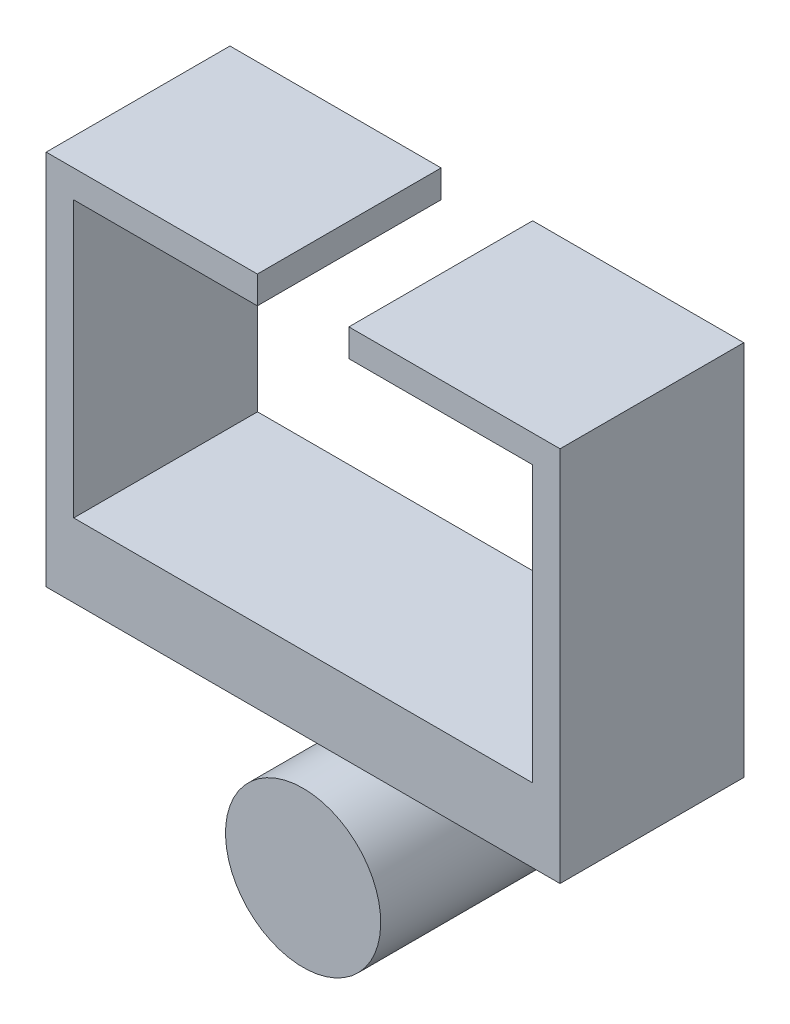
ISO-10303-21;
HEADER;
FILE_DESCRIPTION(('STEP AP214'),'2;1');
FILE_NAME('part.step','',(''),(''),'','','');
FILE_SCHEMA(('AUTOMOTIVE_DESIGN { 1 0 10303 214 1 1 1 1 }'));
ENDSEC;
DATA;
#1=APPLICATION_CONTEXT('core data for automotive mechanical design processes');
#2=APPLICATION_PROTOCOL_DEFINITION('international standard','automotive_design',2000,#1);
#3=PRODUCT_CONTEXT('',#1,'mechanical');
#4=PRODUCT('Part','Part','',(#3));
#5=PRODUCT_RELATED_PRODUCT_CATEGORY('part','',(#4));
#6=PRODUCT_DEFINITION_FORMATION('','',#4);
#7=PRODUCT_DEFINITION_CONTEXT('part definition',#1,'design');
#8=PRODUCT_DEFINITION('design','',#6,#7);
#9=PRODUCT_DEFINITION_SHAPE('','',#8);
#10=(LENGTH_UNIT() NAMED_UNIT(*) SI_UNIT(.MILLI.,.METRE.));
#11=(NAMED_UNIT(*) PLANE_ANGLE_UNIT() SI_UNIT($,.RADIAN.));
#12=(NAMED_UNIT(*) SI_UNIT($,.STERADIAN.) SOLID_ANGLE_UNIT());
#13=UNCERTAINTY_MEASURE_WITH_UNIT(LENGTH_MEASURE(1.E-05),#10,'distance_accuracy_value','');
#14=(GEOMETRIC_REPRESENTATION_CONTEXT(3) GLOBAL_UNCERTAINTY_ASSIGNED_CONTEXT((#13)) GLOBAL_UNIT_ASSIGNED_CONTEXT((#10,
#11,#12)) REPRESENTATION_CONTEXT('',''));
#15=CARTESIAN_POINT('',(0.,0.,0.));
#16=DIRECTION('',(0.,0.,1.));
#17=DIRECTION('',(1.,0.,0.));
#18=AXIS2_PLACEMENT_3D('',#15,#16,#17);
#19=CARTESIAN_POINT('',(0.,0.,25.4));
#20=DIRECTION('',(0.,0.,-1.));
#21=DIRECTION('',(-1.,0.,0.));
#22=AXIS2_PLACEMENT_3D('',#19,#20,#21);
#23=CYLINDRICAL_SURFACE('',#22,10.7286789250919);
#24=CARTESIAN_POINT('',(0.,0.,25.4));
#25=DIRECTION('',(0.,0.,1.));
#26=DIRECTION('',(1.,0.,0.));
#27=AXIS2_PLACEMENT_3D('',#24,#25,#26);
#28=CIRCLE('',#27,10.7286789250919);
#29=CARTESIAN_POINT('',(0.,10.7286789250919,25.4));
#30=VERTEX_POINT('',#29);
#31=EDGE_CURVE('E238',#30,#30,#28,.T.);
#32=ORIENTED_EDGE('',*,*,#31,.F.);
#33=DIRECTION('',(0.,0.,-1.));
#34=VECTOR('',#33,1.);
#35=CARTESIAN_POINT('',(0.,10.7286789250919,25.4));
#36=LINE('',#35,#34);
#37=CARTESIAN_POINT('',(0.,10.7286789250919,6.35));
#38=VERTEX_POINT('',#37);
#39=EDGE_CURVE('E11',#30,#38,#36,.T.);
#40=ORIENTED_EDGE('',*,*,#39,.T.);
#41=CARTESIAN_POINT('',(0.,0.,6.35));
#42=DIRECTION('',(0.,0.,-1.));
#43=DIRECTION('',(-1.,0.,0.));
#44=AXIS2_PLACEMENT_3D('',#41,#42,#43);
#45=CIRCLE('',#44,10.7286789250919);
#46=CARTESIAN_POINT('',(-10.7286789250919,0.,6.35));
#47=VERTEX_POINT('',#46);
#48=EDGE_CURVE('E52',#47,#38,#45,.T.);
#49=ORIENTED_EDGE('',*,*,#48,.F.);
#50=DIRECTION('',(0.,0.,-1.));
#51=VECTOR('',#50,1.);
#52=CARTESIAN_POINT('',(-10.7286789250919,0.,0.));
#53=LINE('',#52,#51);
#54=CARTESIAN_POINT('',(-10.7286789250919,0.,0.));
#55=VERTEX_POINT('',#54);
#56=EDGE_CURVE('E217',#47,#55,#53,.T.);
#57=ORIENTED_EDGE('',*,*,#56,.T.);
#58=CARTESIAN_POINT('',(0.,0.,0.));
#59=DIRECTION('',(0.,0.,1.));
#60=DIRECTION('',(1.,0.,0.));
#61=AXIS2_PLACEMENT_3D('',#58,#59,#60);
#62=CIRCLE('',#61,10.7286789250919);
#63=CARTESIAN_POINT('',(10.7286789250919,0.,0.));
#64=VERTEX_POINT('',#63);
#65=EDGE_CURVE('E239',#55,#64,#62,.T.);
#66=ORIENTED_EDGE('',*,*,#65,.T.);
#67=DIRECTION('',(0.,0.,1.));
#68=VECTOR('',#67,1.);
#69=CARTESIAN_POINT('',(10.7286789250919,0.,0.));
#70=LINE('',#69,#68);
#71=CARTESIAN_POINT('',(10.7286789250919,0.,6.35));
#72=VERTEX_POINT('',#71);
#73=EDGE_CURVE('E219',#64,#72,#70,.T.);
#74=ORIENTED_EDGE('',*,*,#73,.T.);
#75=EDGE_CURVE('E244',#38,#72,#45,.T.);
#76=ORIENTED_EDGE('',*,*,#75,.F.);
#77=ORIENTED_EDGE('',*,*,#39,.F.);
#78=EDGE_LOOP('',(#32,#40,#49,#57,#66,#74,#76,#77));
#79=FACE_BOUND('',#78,.T.);
#80=ADVANCED_FACE('F44',(#79),#23,.T.);
#81=CARTESIAN_POINT('',(0.,0.,25.4));
#82=DIRECTION('',(0.,0.,1.));
#83=DIRECTION('',(1.,0.,0.));
#84=AXIS2_PLACEMENT_3D('',#81,#82,#83);
#85=PLANE('',#84);
#86=ORIENTED_EDGE('',*,*,#31,.T.);
#87=EDGE_LOOP('',(#86));
#88=FACE_BOUND('',#87,.T.);
#89=ADVANCED_FACE('F357',(#88),#85,.T.);
#90=CARTESIAN_POINT('',(0.,0.,0.));
#91=DIRECTION('',(0.,0.,1.));
#92=DIRECTION('',(1.,0.,0.));
#93=AXIS2_PLACEMENT_3D('',#90,#91,#92);
#94=PLANE('',#93);
#95=ORIENTED_EDGE('',*,*,#65,.F.);
#96=DIRECTION('',(0.,1.,0.));
#97=VECTOR('',#96,1.);
#98=CARTESIAN_POINT('',(-10.7286789250919,0.,0.));
#99=LINE('',#98,#97);
#100=CARTESIAN_POINT('',(-10.7286789250919,17.0688,0.));
#101=VERTEX_POINT('',#100);
#102=EDGE_CURVE('E240',#55,#101,#99,.T.);
#103=ORIENTED_EDGE('',*,*,#102,.T.);
#104=DIRECTION('',(1.,0.,0.));
#105=VECTOR('',#104,1.);
#106=CARTESIAN_POINT('',(-35.51174,17.0688,0.));
#107=LINE('',#106,#105);
#108=CARTESIAN_POINT('',(-35.51174,17.0688,0.));
#109=VERTEX_POINT('',#108);
#110=EDGE_CURVE('E183',#109,#101,#107,.T.);
#111=ORIENTED_EDGE('',*,*,#110,.F.);
#112=DIRECTION('',(0.,-1.,0.));
#113=VECTOR('',#112,1.);
#114=CARTESIAN_POINT('',(-35.51174,69.1134,0.));
#115=LINE('',#114,#113);
#116=CARTESIAN_POINT('',(-35.51174,69.1134,0.));
#117=VERTEX_POINT('',#116);
#118=EDGE_CURVE('E180',#117,#109,#115,.T.);
#119=ORIENTED_EDGE('',*,*,#118,.F.);
#120=DIRECTION('',(-1.,0.,0.));
#121=VECTOR('',#120,1.);
#122=CARTESIAN_POINT('',(-6.32459999999996,69.1134,0.));
#123=LINE('',#122,#121);
#124=CARTESIAN_POINT('',(-6.32459999999996,69.1134,0.));
#125=VERTEX_POINT('',#124);
#126=EDGE_CURVE('E159',#125,#117,#123,.T.);
#127=ORIENTED_EDGE('',*,*,#126,.F.);
#128=DIRECTION('',(0.,1.,0.));
#129=VECTOR('',#128,1.);
#130=CARTESIAN_POINT('',(-6.32459999999999,65.3034,0.));
#131=LINE('',#130,#129);
#132=CARTESIAN_POINT('',(-6.32459999999999,65.3034,0.));
#133=VERTEX_POINT('',#132);
#134=EDGE_CURVE('E172',#133,#125,#131,.T.);
#135=ORIENTED_EDGE('',*,*,#134,.F.);
#136=DIRECTION('',(1.,0.,0.));
#137=VECTOR('',#136,1.);
#138=CARTESIAN_POINT('',(-31.70428,65.3034,0.));
#139=LINE('',#138,#137);
#140=CARTESIAN_POINT('',(-31.70428,65.3034,0.));
#141=VERTEX_POINT('',#140);
#142=EDGE_CURVE('E277',#141,#133,#139,.T.);
#143=ORIENTED_EDGE('',*,*,#142,.F.);
#144=DIRECTION('',(0.,1.,0.));
#145=VECTOR('',#144,1.);
#146=CARTESIAN_POINT('',(-31.70428,27.2288,0.));
#147=LINE('',#146,#145);
#148=CARTESIAN_POINT('',(-31.70428,27.2288,0.));
#149=VERTEX_POINT('',#148);
#150=EDGE_CURVE('E273',#149,#141,#147,.T.);
#151=ORIENTED_EDGE('',*,*,#150,.F.);
#152=DIRECTION('',(-1.,0.,0.));
#153=VECTOR('',#152,1.);
#154=CARTESIAN_POINT('',(31.70428,27.2288,0.));
#155=LINE('',#154,#153);
#156=CARTESIAN_POINT('',(31.70428,27.2288,0.));
#157=VERTEX_POINT('',#156);
#158=EDGE_CURVE('E275',#157,#149,#155,.T.);
#159=ORIENTED_EDGE('',*,*,#158,.F.);
#160=DIRECTION('',(0.,-1.,0.));
#161=VECTOR('',#160,1.);
#162=CARTESIAN_POINT('',(31.70428,65.3034,0.));
#163=LINE('',#162,#161);
#164=CARTESIAN_POINT('',(31.70428,65.3034,0.));
#165=VERTEX_POINT('',#164);
#166=EDGE_CURVE('E269',#165,#157,#163,.T.);
#167=ORIENTED_EDGE('',*,*,#166,.F.);
#168=DIRECTION('',(1.,0.,0.));
#169=VECTOR('',#168,1.);
#170=CARTESIAN_POINT('',(6.32459999999999,65.3034,0.));
#171=LINE('',#170,#169);
#172=CARTESIAN_POINT('',(6.32459999999999,65.3034,0.));
#173=VERTEX_POINT('',#172);
#174=EDGE_CURVE('E268',#173,#165,#171,.T.);
#175=ORIENTED_EDGE('',*,*,#174,.F.);
#176=DIRECTION('',(0.,-1.,0.));
#177=VECTOR('',#176,1.);
#178=CARTESIAN_POINT('',(6.32459999999999,69.1134,0.));
#179=LINE('',#178,#177);
#180=CARTESIAN_POINT('',(6.32459999999999,69.1134,0.));
#181=VERTEX_POINT('',#180);
#182=EDGE_CURVE('E262',#181,#173,#179,.T.);
#183=ORIENTED_EDGE('',*,*,#182,.F.);
#184=DIRECTION('',(-1.,0.,0.));
#185=VECTOR('',#184,1.);
#186=CARTESIAN_POINT('',(35.51174,69.1134,0.));
#187=LINE('',#186,#185);
#188=CARTESIAN_POINT('',(35.51174,69.1134,0.));
#189=VERTEX_POINT('',#188);
#190=EDGE_CURVE('E257',#189,#181,#187,.T.);
#191=ORIENTED_EDGE('',*,*,#190,.F.);
#192=DIRECTION('',(0.,1.,0.));
#193=VECTOR('',#192,1.);
#194=CARTESIAN_POINT('',(35.51174,17.0688,0.));
#195=LINE('',#194,#193);
#196=CARTESIAN_POINT('',(35.51174,17.0688,0.));
#197=VERTEX_POINT('',#196);
#198=EDGE_CURVE('E259',#197,#189,#195,.T.);
#199=ORIENTED_EDGE('',*,*,#198,.F.);
#200=CARTESIAN_POINT('',(10.7286789250919,17.0688,0.));
#201=VERTEX_POINT('',#200);
#202=EDGE_CURVE('E194',#201,#197,#107,.T.);
#203=ORIENTED_EDGE('',*,*,#202,.F.);
#204=DIRECTION('',(0.,1.,0.));
#205=VECTOR('',#204,1.);
#206=CARTESIAN_POINT('',(10.7286789250919,0.,0.));
#207=LINE('',#206,#205);
#208=EDGE_CURVE('E231',#64,#201,#207,.T.);
#209=ORIENTED_EDGE('',*,*,#208,.F.);
#210=EDGE_LOOP('',(#95,#103,#111,#119,#127,#135,#143,#151,#159,#167,#175,#183,#191,#199,#203,#209));
#211=FACE_BOUND('',#210,.T.);
#212=ADVANCED_FACE('F181',(#211),#94,.F.);
#213=CARTESIAN_POINT('',(-10.7286789250919,0.,0.));
#214=DIRECTION('',(1.,0.,0.));
#215=DIRECTION('',(0.,0.,-1.));
#216=AXIS2_PLACEMENT_3D('',#213,#214,#215);
#217=PLANE('',#216);
#218=DIRECTION('',(0.,0.,-1.));
#219=VECTOR('',#218,1.);
#220=CARTESIAN_POINT('',(-10.7286789250919,17.0688,0.));
#221=LINE('',#220,#219);
#222=CARTESIAN_POINT('',(-10.7286789250919,17.0688,6.35));
#223=VERTEX_POINT('',#222);
#224=EDGE_CURVE('E189',#223,#101,#221,.T.);
#225=ORIENTED_EDGE('',*,*,#224,.T.);
#226=ORIENTED_EDGE('',*,*,#102,.F.);
#227=ORIENTED_EDGE('',*,*,#56,.F.);
#228=DIRECTION('',(0.,1.,0.));
#229=VECTOR('',#228,1.);
#230=CARTESIAN_POINT('',(-10.7286789250919,0.,6.35));
#231=LINE('',#230,#229);
#232=EDGE_CURVE('E224',#47,#223,#231,.T.);
#233=ORIENTED_EDGE('',*,*,#232,.T.);
#234=EDGE_LOOP('',(#225,#226,#227,#233));
#235=FACE_BOUND('',#234,.T.);
#236=ADVANCED_FACE('F370',(#235),#217,.F.);
#237=CARTESIAN_POINT('',(10.7286789250919,0.,0.));
#238=DIRECTION('',(-1.,0.,0.));
#239=DIRECTION('',(0.,0.,1.));
#240=AXIS2_PLACEMENT_3D('',#237,#238,#239);
#241=PLANE('',#240);
#242=DIRECTION('',(0.,0.,1.));
#243=VECTOR('',#242,1.);
#244=CARTESIAN_POINT('',(10.7286789250919,17.0688,0.));
#245=LINE('',#244,#243);
#246=CARTESIAN_POINT('',(10.7286789250919,17.0688,6.35));
#247=VERTEX_POINT('',#246);
#248=EDGE_CURVE('E188',#201,#247,#245,.T.);
#249=ORIENTED_EDGE('',*,*,#248,.T.);
#250=DIRECTION('',(0.,1.,0.));
#251=VECTOR('',#250,1.);
#252=CARTESIAN_POINT('',(10.7286789250919,0.,6.35));
#253=LINE('',#252,#251);
#254=EDGE_CURVE('E232',#72,#247,#253,.T.);
#255=ORIENTED_EDGE('',*,*,#254,.F.);
#256=ORIENTED_EDGE('',*,*,#73,.F.);
#257=ORIENTED_EDGE('',*,*,#208,.T.);
#258=EDGE_LOOP('',(#249,#255,#256,#257));
#259=FACE_BOUND('',#258,.T.);
#260=ADVANCED_FACE('F253',(#259),#241,.F.);
#261=CARTESIAN_POINT('',(-10.7286789250919,0.,6.35));
#262=DIRECTION('',(0.,0.,-1.));
#263=DIRECTION('',(-1.,0.,0.));
#264=AXIS2_PLACEMENT_3D('',#261,#262,#263);
#265=PLANE('',#264);
#266=ORIENTED_EDGE('',*,*,#232,.F.);
#267=ORIENTED_EDGE('',*,*,#48,.T.);
#268=ORIENTED_EDGE('',*,*,#75,.T.);
#269=ORIENTED_EDGE('',*,*,#254,.T.);
#270=DIRECTION('',(-1.,0.,0.));
#271=VECTOR('',#270,1.);
#272=CARTESIAN_POINT('',(-10.7286789250919,17.0688,6.35));
#273=LINE('',#272,#271);
#274=EDGE_CURVE('E222',#247,#223,#273,.T.);
#275=ORIENTED_EDGE('',*,*,#274,.T.);
#276=EDGE_LOOP('',(#266,#267,#268,#269,#275));
#277=FACE_BOUND('',#276,.T.);
#278=ADVANCED_FACE('F247',(#277),#265,.F.);
#279=CARTESIAN_POINT('',(-35.51174,69.1134,25.4));
#280=DIRECTION('',(1.,0.,0.));
#281=DIRECTION('',(0.,1.,0.));
#282=AXIS2_PLACEMENT_3D('',#279,#280,#281);
#283=PLANE('',#282);
#284=ORIENTED_EDGE('',*,*,#118,.T.);
#285=DIRECTION('',(0.,0.,-1.));
#286=VECTOR('',#285,1.);
#287=CARTESIAN_POINT('',(-35.51174,17.0688,25.4));
#288=LINE('',#287,#286);
#289=CARTESIAN_POINT('',(-35.51174,17.0688,25.4));
#290=VERTEX_POINT('',#289);
#291=EDGE_CURVE('E303',#290,#109,#288,.T.);
#292=ORIENTED_EDGE('',*,*,#291,.F.);
#293=DIRECTION('',(0.,-1.,0.));
#294=VECTOR('',#293,1.);
#295=CARTESIAN_POINT('',(-35.51174,69.1134,25.4));
#296=LINE('',#295,#294);
#297=CARTESIAN_POINT('',(-35.51174,69.1134,25.4));
#298=VERTEX_POINT('',#297);
#299=EDGE_CURVE('E174',#298,#290,#296,.T.);
#300=ORIENTED_EDGE('',*,*,#299,.F.);
#301=DIRECTION('',(0.,0.,-1.));
#302=VECTOR('',#301,1.);
#303=CARTESIAN_POINT('',(-35.51174,69.1134,25.4));
#304=LINE('',#303,#302);
#305=EDGE_CURVE('E163',#298,#117,#304,.T.);
#306=ORIENTED_EDGE('',*,*,#305,.T.);
#307=EDGE_LOOP('',(#284,#292,#300,#306));
#308=FACE_BOUND('',#307,.T.);
#309=ADVANCED_FACE('F177',(#308),#283,.F.);
#310=CARTESIAN_POINT('',(-35.51174,17.0688,25.4));
#311=DIRECTION('',(0.,1.,0.));
#312=DIRECTION('',(-1.,0.,0.));
#313=AXIS2_PLACEMENT_3D('',#310,#311,#312);
#314=PLANE('',#313);
#315=ORIENTED_EDGE('',*,*,#224,.F.);
#316=ORIENTED_EDGE('',*,*,#274,.F.);
#317=ORIENTED_EDGE('',*,*,#248,.F.);
#318=ORIENTED_EDGE('',*,*,#202,.T.);
#319=DIRECTION('',(0.,0.,-1.));
#320=VECTOR('',#319,1.);
#321=CARTESIAN_POINT('',(35.51174,17.0688,25.4));
#322=LINE('',#321,#320);
#323=CARTESIAN_POINT('',(35.51174,17.0688,25.4));
#324=VERTEX_POINT('',#323);
#325=EDGE_CURVE('E305',#324,#197,#322,.T.);
#326=ORIENTED_EDGE('',*,*,#325,.F.);
#327=DIRECTION('',(1.,0.,0.));
#328=VECTOR('',#327,1.);
#329=CARTESIAN_POINT('',(-35.51174,17.0688,25.4));
#330=LINE('',#329,#328);
#331=EDGE_CURVE('E214',#290,#324,#330,.T.);
#332=ORIENTED_EDGE('',*,*,#331,.F.);
#333=ORIENTED_EDGE('',*,*,#291,.T.);
#334=ORIENTED_EDGE('',*,*,#110,.T.);
#335=EDGE_LOOP('',(#315,#316,#317,#318,#326,#332,#333,#334));
#336=FACE_BOUND('',#335,.T.);
#337=ADVANCED_FACE('F255',(#336),#314,.F.);
#338=CARTESIAN_POINT('',(35.51174,17.0688,25.4));
#339=DIRECTION('',(-1.,0.,0.));
#340=DIRECTION('',(0.,-1.,0.));
#341=AXIS2_PLACEMENT_3D('',#338,#339,#340);
#342=PLANE('',#341);
#343=ORIENTED_EDGE('',*,*,#198,.T.);
#344=DIRECTION('',(0.,0.,-1.));
#345=VECTOR('',#344,1.);
#346=CARTESIAN_POINT('',(35.51174,69.1134,25.4));
#347=LINE('',#346,#345);
#348=CARTESIAN_POINT('',(35.51174,69.1134,25.4));
#349=VERTEX_POINT('',#348);
#350=EDGE_CURVE('E302',#349,#189,#347,.T.);
#351=ORIENTED_EDGE('',*,*,#350,.F.);
#352=DIRECTION('',(0.,1.,0.));
#353=VECTOR('',#352,1.);
#354=CARTESIAN_POINT('',(35.51174,17.0688,25.4));
#355=LINE('',#354,#353);
#356=EDGE_CURVE('E213',#324,#349,#355,.T.);
#357=ORIENTED_EDGE('',*,*,#356,.F.);
#358=ORIENTED_EDGE('',*,*,#325,.T.);
#359=EDGE_LOOP('',(#343,#351,#357,#358));
#360=FACE_BOUND('',#359,.T.);
#361=ADVANCED_FACE('F347',(#360),#342,.F.);
#362=CARTESIAN_POINT('',(35.51174,69.1134,25.4));
#363=DIRECTION('',(0.,-1.,0.));
#364=DIRECTION('',(0.,0.,-1.));
#365=AXIS2_PLACEMENT_3D('',#362,#363,#364);
#366=PLANE('',#365);
#367=ORIENTED_EDGE('',*,*,#190,.T.);
#368=DIRECTION('',(0.,0.,-1.));
#369=VECTOR('',#368,1.);
#370=CARTESIAN_POINT('',(6.32459999999999,69.1134,25.4));
#371=LINE('',#370,#369);
#372=CARTESIAN_POINT('',(6.32459999999999,69.1134,25.4));
#373=VERTEX_POINT('',#372);
#374=EDGE_CURVE('E300',#373,#181,#371,.T.);
#375=ORIENTED_EDGE('',*,*,#374,.F.);
#376=DIRECTION('',(-1.,0.,0.));
#377=VECTOR('',#376,1.);
#378=CARTESIAN_POINT('',(35.51174,69.1134,25.4));
#379=LINE('',#378,#377);
#380=EDGE_CURVE('E211',#349,#373,#379,.T.);
#381=ORIENTED_EDGE('',*,*,#380,.F.);
#382=ORIENTED_EDGE('',*,*,#350,.T.);
#383=EDGE_LOOP('',(#367,#375,#381,#382));
#384=FACE_BOUND('',#383,.T.);
#385=ADVANCED_FACE('F341',(#384),#366,.F.);
#386=CARTESIAN_POINT('',(6.32459999999999,69.1134,25.4));
#387=DIRECTION('',(1.,0.,0.));
#388=DIRECTION('',(0.,1.,0.));
#389=AXIS2_PLACEMENT_3D('',#386,#387,#388);
#390=PLANE('',#389);
#391=ORIENTED_EDGE('',*,*,#182,.T.);
#392=DIRECTION('',(0.,0.,-1.));
#393=VECTOR('',#392,1.);
#394=CARTESIAN_POINT('',(6.32459999999999,65.3034,25.4));
#395=LINE('',#394,#393);
#396=CARTESIAN_POINT('',(6.32459999999999,65.3034,25.4));
#397=VERTEX_POINT('',#396);
#398=EDGE_CURVE('E293',#397,#173,#395,.T.);
#399=ORIENTED_EDGE('',*,*,#398,.F.);
#400=DIRECTION('',(0.,-1.,0.));
#401=VECTOR('',#400,1.);
#402=CARTESIAN_POINT('',(6.32459999999999,69.1134,25.4));
#403=LINE('',#402,#401);
#404=EDGE_CURVE('E207',#373,#397,#403,.T.);
#405=ORIENTED_EDGE('',*,*,#404,.F.);
#406=ORIENTED_EDGE('',*,*,#374,.T.);
#407=EDGE_LOOP('',(#391,#399,#405,#406));
#408=FACE_BOUND('',#407,.T.);
#409=ADVANCED_FACE('F342',(#408),#390,.F.);
#410=CARTESIAN_POINT('',(6.32459999999999,65.3034,25.4));
#411=DIRECTION('',(0.,1.,0.));
#412=DIRECTION('',(0.,0.,1.));
#413=AXIS2_PLACEMENT_3D('',#410,#411,#412);
#414=PLANE('',#413);
#415=ORIENTED_EDGE('',*,*,#174,.T.);
#416=DIRECTION('',(0.,0.,-1.));
#417=VECTOR('',#416,1.);
#418=CARTESIAN_POINT('',(31.70428,65.3034,25.4));
#419=LINE('',#418,#417);
#420=CARTESIAN_POINT('',(31.70428,65.3034,25.4));
#421=VERTEX_POINT('',#420);
#422=EDGE_CURVE('E295',#421,#165,#419,.T.);
#423=ORIENTED_EDGE('',*,*,#422,.F.);
#424=DIRECTION('',(1.,0.,0.));
#425=VECTOR('',#424,1.);
#426=CARTESIAN_POINT('',(6.32459999999999,65.3034,25.4));
#427=LINE('',#426,#425);
#428=EDGE_CURVE('E210',#397,#421,#427,.T.);
#429=ORIENTED_EDGE('',*,*,#428,.F.);
#430=ORIENTED_EDGE('',*,*,#398,.T.);
#431=EDGE_LOOP('',(#415,#423,#429,#430));
#432=FACE_BOUND('',#431,.T.);
#433=ADVANCED_FACE('F339',(#432),#414,.F.);
#434=CARTESIAN_POINT('',(31.70428,65.3034,25.4));
#435=DIRECTION('',(1.,0.,0.));
#436=DIRECTION('',(0.,1.,0.));
#437=AXIS2_PLACEMENT_3D('',#434,#435,#436);
#438=PLANE('',#437);
#439=ORIENTED_EDGE('',*,*,#166,.T.);
#440=DIRECTION('',(0.,0.,-1.));
#441=VECTOR('',#440,1.);
#442=CARTESIAN_POINT('',(31.70428,27.2288,25.4));
#443=LINE('',#442,#441);
#444=CARTESIAN_POINT('',(31.70428,27.2288,25.4));
#445=VERTEX_POINT('',#444);
#446=EDGE_CURVE('E286',#445,#157,#443,.T.);
#447=ORIENTED_EDGE('',*,*,#446,.F.);
#448=DIRECTION('',(0.,-1.,0.));
#449=VECTOR('',#448,1.);
#450=CARTESIAN_POINT('',(31.70428,65.3034,25.4));
#451=LINE('',#450,#449);
#452=EDGE_CURVE('E202',#421,#445,#451,.T.);
#453=ORIENTED_EDGE('',*,*,#452,.F.);
#454=ORIENTED_EDGE('',*,*,#422,.T.);
#455=EDGE_LOOP('',(#439,#447,#453,#454));
#456=FACE_BOUND('',#455,.T.);
#457=ADVANCED_FACE('F335',(#456),#438,.F.);
#458=CARTESIAN_POINT('',(31.70428,27.2288,25.4));
#459=DIRECTION('',(0.,-1.,0.));
#460=DIRECTION('',(1.,0.,0.));
#461=AXIS2_PLACEMENT_3D('',#458,#459,#460);
#462=PLANE('',#461);
#463=ORIENTED_EDGE('',*,*,#158,.T.);
#464=DIRECTION('',(0.,0.,-1.));
#465=VECTOR('',#464,1.);
#466=CARTESIAN_POINT('',(-31.70428,27.2288,25.4));
#467=LINE('',#466,#465);
#468=CARTESIAN_POINT('',(-31.70428,27.2288,25.4));
#469=VERTEX_POINT('',#468);
#470=EDGE_CURVE('E287',#469,#149,#467,.T.);
#471=ORIENTED_EDGE('',*,*,#470,.F.);
#472=DIRECTION('',(-1.,0.,0.));
#473=VECTOR('',#472,1.);
#474=CARTESIAN_POINT('',(31.70428,27.2288,25.4));
#475=LINE('',#474,#473);
#476=EDGE_CURVE('E201',#445,#469,#475,.T.);
#477=ORIENTED_EDGE('',*,*,#476,.F.);
#478=ORIENTED_EDGE('',*,*,#446,.T.);
#479=EDGE_LOOP('',(#463,#471,#477,#478));
#480=FACE_BOUND('',#479,.T.);
#481=ADVANCED_FACE('F326',(#480),#462,.F.);
#482=CARTESIAN_POINT('',(-31.70428,27.2288,25.4));
#483=DIRECTION('',(-1.,0.,0.));
#484=DIRECTION('',(0.,0.,1.));
#485=AXIS2_PLACEMENT_3D('',#482,#483,#484);
#486=PLANE('',#485);
#487=ORIENTED_EDGE('',*,*,#150,.T.);
#488=DIRECTION('',(0.,0.,-1.));
#489=VECTOR('',#488,1.);
#490=CARTESIAN_POINT('',(-31.70428,65.3034,25.4));
#491=LINE('',#490,#489);
#492=CARTESIAN_POINT('',(-31.70428,65.3034,25.4));
#493=VERTEX_POINT('',#492);
#494=EDGE_CURVE('E285',#493,#141,#491,.T.);
#495=ORIENTED_EDGE('',*,*,#494,.F.);
#496=DIRECTION('',(0.,1.,0.));
#497=VECTOR('',#496,1.);
#498=CARTESIAN_POINT('',(-31.70428,27.2288,25.4));
#499=LINE('',#498,#497);
#500=EDGE_CURVE('E203',#469,#493,#499,.T.);
#501=ORIENTED_EDGE('',*,*,#500,.F.);
#502=ORIENTED_EDGE('',*,*,#470,.T.);
#503=EDGE_LOOP('',(#487,#495,#501,#502));
#504=FACE_BOUND('',#503,.T.);
#505=ADVANCED_FACE('F325',(#504),#486,.F.);
#506=CARTESIAN_POINT('',(-31.70428,65.3034,25.4));
#507=DIRECTION('',(0.,1.,0.));
#508=DIRECTION('',(-1.,0.,0.));
#509=AXIS2_PLACEMENT_3D('',#506,#507,#508);
#510=PLANE('',#509);
#511=ORIENTED_EDGE('',*,*,#142,.T.);
#512=DIRECTION('',(0.,0.,-1.));
#513=VECTOR('',#512,1.);
#514=CARTESIAN_POINT('',(-6.32459999999999,65.3034,25.4));
#515=LINE('',#514,#513);
#516=CARTESIAN_POINT('',(-6.32459999999999,65.3034,25.4));
#517=VERTEX_POINT('',#516);
#518=EDGE_CURVE('E278',#517,#133,#515,.T.);
#519=ORIENTED_EDGE('',*,*,#518,.F.);
#520=DIRECTION('',(1.,0.,0.));
#521=VECTOR('',#520,1.);
#522=CARTESIAN_POINT('',(-31.70428,65.3034,25.4));
#523=LINE('',#522,#521);
#524=EDGE_CURVE('E200',#493,#517,#523,.T.);
#525=ORIENTED_EDGE('',*,*,#524,.F.);
#526=ORIENTED_EDGE('',*,*,#494,.T.);
#527=EDGE_LOOP('',(#511,#519,#525,#526));
#528=FACE_BOUND('',#527,.T.);
#529=ADVANCED_FACE('F318',(#528),#510,.F.);
#530=CARTESIAN_POINT('',(-6.32459999999999,65.3034,25.4));
#531=DIRECTION('',(-1.,0.,0.));
#532=DIRECTION('',(0.,-1.,0.));
#533=AXIS2_PLACEMENT_3D('',#530,#531,#532);
#534=PLANE('',#533);
#535=ORIENTED_EDGE('',*,*,#134,.T.);
#536=DIRECTION('',(0.,0.,-1.));
#537=VECTOR('',#536,1.);
#538=CARTESIAN_POINT('',(-6.32459999999996,69.1134,25.4));
#539=LINE('',#538,#537);
#540=CARTESIAN_POINT('',(-6.32459999999996,69.1134,25.4));
#541=VERTEX_POINT('',#540);
#542=EDGE_CURVE('E170',#541,#125,#539,.T.);
#543=ORIENTED_EDGE('',*,*,#542,.F.);
#544=DIRECTION('',(0.,1.,0.));
#545=VECTOR('',#544,1.);
#546=CARTESIAN_POINT('',(-6.32459999999999,65.3034,25.4));
#547=LINE('',#546,#545);
#548=EDGE_CURVE('E197',#517,#541,#547,.T.);
#549=ORIENTED_EDGE('',*,*,#548,.F.);
#550=ORIENTED_EDGE('',*,*,#518,.T.);
#551=EDGE_LOOP('',(#535,#543,#549,#550));
#552=FACE_BOUND('',#551,.T.);
#553=ADVANCED_FACE('F311',(#552),#534,.F.);
#554=CARTESIAN_POINT('',(-6.32459999999996,69.1134,25.4));
#555=DIRECTION('',(0.,-1.,0.));
#556=DIRECTION('',(1.,0.,0.));
#557=AXIS2_PLACEMENT_3D('',#554,#555,#556);
#558=PLANE('',#557);
#559=ORIENTED_EDGE('',*,*,#126,.T.);
#560=ORIENTED_EDGE('',*,*,#305,.F.);
#561=DIRECTION('',(-1.,0.,0.));
#562=VECTOR('',#561,1.);
#563=CARTESIAN_POINT('',(-6.32459999999996,69.1134,25.4));
#564=LINE('',#563,#562);
#565=EDGE_CURVE('E178',#541,#298,#564,.T.);
#566=ORIENTED_EDGE('',*,*,#565,.F.);
#567=ORIENTED_EDGE('',*,*,#542,.T.);
#568=EDGE_LOOP('',(#559,#560,#566,#567));
#569=FACE_BOUND('',#568,.T.);
#570=ADVANCED_FACE('F165',(#569),#558,.F.);
#571=CARTESIAN_POINT('',(0.,0.,25.4));
#572=DIRECTION('',(0.,0.,1.));
#573=DIRECTION('',(1.,0.,0.));
#574=AXIS2_PLACEMENT_3D('',#571,#572,#573);
#575=PLANE('',#574);
#576=ORIENTED_EDGE('',*,*,#299,.T.);
#577=ORIENTED_EDGE('',*,*,#331,.T.);
#578=ORIENTED_EDGE('',*,*,#356,.T.);
#579=ORIENTED_EDGE('',*,*,#380,.T.);
#580=ORIENTED_EDGE('',*,*,#404,.T.);
#581=ORIENTED_EDGE('',*,*,#428,.T.);
#582=ORIENTED_EDGE('',*,*,#452,.T.);
#583=ORIENTED_EDGE('',*,*,#476,.T.);
#584=ORIENTED_EDGE('',*,*,#500,.T.);
#585=ORIENTED_EDGE('',*,*,#524,.T.);
#586=ORIENTED_EDGE('',*,*,#548,.T.);
#587=ORIENTED_EDGE('',*,*,#565,.T.);
#588=EDGE_LOOP('',(#576,#577,#578,#579,#580,#581,#582,#583,#584,#585,#586,#587));
#589=FACE_BOUND('',#588,.T.);
#590=ADVANCED_FACE('F306',(#589),#575,.T.);
#591=CLOSED_SHELL('',(#80,#89,#212,#236,#260,#278,#309,#337,#361,#385,#409,#433,#457,#481,#505,
#529,#553,#570,#590));
#592=MANIFOLD_SOLID_BREP('B2',#591);
#593=ADVANCED_BREP_SHAPE_REPRESENTATION('',(#18,#592),#14);
#594=SHAPE_DEFINITION_REPRESENTATION(#9,#593);
ENDSEC;
END-ISO-10303-21;
